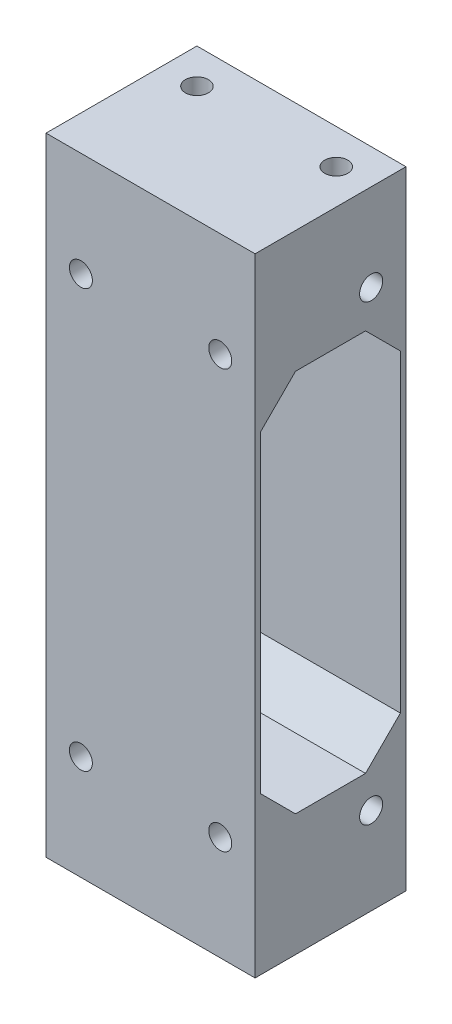
ISO-10303-21;
HEADER;
FILE_DESCRIPTION(('STEP AP214'),'2;1');
FILE_NAME('part.step','',(''),(''),'','','');
FILE_SCHEMA(('AUTOMOTIVE_DESIGN { 1 0 10303 214 1 1 1 1 }'));
ENDSEC;
DATA;
#1=APPLICATION_CONTEXT('core data for automotive mechanical design processes');
#2=APPLICATION_PROTOCOL_DEFINITION('international standard','automotive_design',2000,#1);
#3=PRODUCT_CONTEXT('',#1,'mechanical');
#4=PRODUCT('Part','Part','',(#3));
#5=PRODUCT_RELATED_PRODUCT_CATEGORY('part','',(#4));
#6=PRODUCT_DEFINITION_FORMATION('','',#4);
#7=PRODUCT_DEFINITION_CONTEXT('part definition',#1,'design');
#8=PRODUCT_DEFINITION('design','',#6,#7);
#9=PRODUCT_DEFINITION_SHAPE('','',#8);
#10=(LENGTH_UNIT() NAMED_UNIT(*) SI_UNIT(.MILLI.,.METRE.));
#11=(NAMED_UNIT(*) PLANE_ANGLE_UNIT() SI_UNIT($,.RADIAN.));
#12=(NAMED_UNIT(*) SI_UNIT($,.STERADIAN.) SOLID_ANGLE_UNIT());
#13=UNCERTAINTY_MEASURE_WITH_UNIT(LENGTH_MEASURE(1.E-05),#10,'distance_accuracy_value','');
#14=(GEOMETRIC_REPRESENTATION_CONTEXT(3) GLOBAL_UNCERTAINTY_ASSIGNED_CONTEXT((#13)) GLOBAL_UNIT_ASSIGNED_CONTEXT((#10,
#11,#12)) REPRESENTATION_CONTEXT('',''));
#15=CARTESIAN_POINT('',(0.,0.,0.));
#16=DIRECTION('',(0.,0.,1.));
#17=DIRECTION('',(1.,0.,0.));
#18=AXIS2_PLACEMENT_3D('',#15,#16,#17);
#19=CARTESIAN_POINT('',(15.,90.,10.825));
#20=DIRECTION('',(-1.,0.,0.));
#21=DIRECTION('',(0.,0.,1.));
#22=AXIS2_PLACEMENT_3D('',#19,#20,#21);
#23=PLANE('',#22);
#24=CARTESIAN_POINT('',(15.,12.5,-5.825));
#25=DIRECTION('',(1.,0.,0.));
#26=DIRECTION('',(0.,0.,-1.));
#27=AXIS2_PLACEMENT_3D('',#24,#25,#26);
#28=CIRCLE('',#27,1.64999999999999);
#29=CARTESIAN_POINT('',(15.,12.5,-7.47499999999999));
#30=VERTEX_POINT('',#29);
#31=EDGE_CURVE('E180',#30,#30,#28,.T.);
#32=ORIENTED_EDGE('',*,*,#31,.F.);
#33=EDGE_LOOP('',(#32));
#34=FACE_BOUND('',#33,.T.);
#35=CARTESIAN_POINT('',(15.,77.5,-5.825));
#36=DIRECTION('',(1.,0.,0.));
#37=DIRECTION('',(0.,0.,-1.));
#38=AXIS2_PLACEMENT_3D('',#35,#36,#37);
#39=CIRCLE('',#38,1.64999999999998);
#40=CARTESIAN_POINT('',(15.,77.5,-7.47499999999999));
#41=VERTEX_POINT('',#40);
#42=EDGE_CURVE('E179',#41,#41,#39,.T.);
#43=ORIENTED_EDGE('',*,*,#42,.F.);
#44=EDGE_LOOP('',(#43));
#45=FACE_BOUND('',#44,.T.);
#46=DIRECTION('',(0.,0.,1.));
#47=VECTOR('',#46,1.);
#48=CARTESIAN_POINT('',(15.,72.5,10.025));
#49=LINE('',#48,#47);
#50=CARTESIAN_POINT('',(15.,72.5,-5.02499999999996));
#51=VERTEX_POINT('',#50);
#52=CARTESIAN_POINT('',(15.,72.5,5.02500000000001));
#53=VERTEX_POINT('',#52);
#54=EDGE_CURVE('E245',#51,#53,#49,.T.);
#55=ORIENTED_EDGE('',*,*,#54,.F.);
#56=DIRECTION('',(0.,0.707106781186544,0.707106781186552));
#57=VECTOR('',#56,1.);
#58=CARTESIAN_POINT('',(15.,89.1749999999999,11.6500000000001));
#59=LINE('',#58,#57);
#60=CARTESIAN_POINT('',(15.,67.5,-10.025));
#61=VERTEX_POINT('',#60);
#62=EDGE_CURVE('E361',#51,#61,#59,.F.);
#63=ORIENTED_EDGE('',*,*,#62,.T.);
#64=DIRECTION('',(0.,1.,0.));
#65=VECTOR('',#64,1.);
#66=CARTESIAN_POINT('',(15.,17.5,-10.025));
#67=LINE('',#66,#65);
#68=CARTESIAN_POINT('',(15.,22.5,-10.025));
#69=VERTEX_POINT('',#68);
#70=EDGE_CURVE('E225',#69,#61,#67,.T.);
#71=ORIENTED_EDGE('',*,*,#70,.F.);
#72=DIRECTION('',(0.,0.707106781186552,-0.707106781186544));
#73=VECTOR('',#72,1.);
#74=CARTESIAN_POINT('',(15.,45.8250000000004,-33.3500000000001));
#75=LINE('',#74,#73);
#76=CARTESIAN_POINT('',(15.,17.5,-5.02500000000001));
#77=VERTEX_POINT('',#76);
#78=EDGE_CURVE('E367',#69,#77,#75,.F.);
#79=ORIENTED_EDGE('',*,*,#78,.T.);
#80=DIRECTION('',(0.,0.,-1.));
#81=VECTOR('',#80,1.);
#82=CARTESIAN_POINT('',(15.,17.5,10.025));
#83=LINE('',#82,#81);
#84=CARTESIAN_POINT('',(15.,17.5,5.02499999999996));
#85=VERTEX_POINT('',#84);
#86=EDGE_CURVE('E231',#85,#77,#83,.T.);
#87=ORIENTED_EDGE('',*,*,#86,.F.);
#88=DIRECTION('',(0.,-0.707106781186544,-0.707106781186552));
#89=VECTOR('',#88,1.);
#90=CARTESIAN_POINT('',(15.,56.6499999999996,44.175));
#91=LINE('',#90,#89);
#92=CARTESIAN_POINT('',(15.,22.5,10.025));
#93=VERTEX_POINT('',#92);
#94=EDGE_CURVE('E62',#85,#93,#91,.F.);
#95=ORIENTED_EDGE('',*,*,#94,.T.);
#96=DIRECTION('',(0.,-1.,0.));
#97=VECTOR('',#96,1.);
#98=CARTESIAN_POINT('',(15.,17.5,10.025));
#99=LINE('',#98,#97);
#100=CARTESIAN_POINT('',(15.,67.4999999999999,10.025));
#101=VERTEX_POINT('',#100);
#102=EDGE_CURVE('E249',#101,#93,#99,.T.);
#103=ORIENTED_EDGE('',*,*,#102,.F.);
#104=DIRECTION('',(0.,-0.707106781186552,0.707106781186544));
#105=VECTOR('',#104,1.);
#106=CARTESIAN_POINT('',(15.,78.3500000000001,-0.825000000000031));
#107=LINE('',#106,#105);
#108=EDGE_CURVE('E355',#101,#53,#107,.F.);
#109=ORIENTED_EDGE('',*,*,#108,.T.);
#110=EDGE_LOOP('',(#55,#63,#71,#79,#87,#95,#103,#109));
#111=FACE_BOUND('',#110,.T.);
#112=DIRECTION('',(0.,0.,-1.));
#113=VECTOR('',#112,1.);
#114=CARTESIAN_POINT('',(15.,0.,10.825));
#115=LINE('',#114,#113);
#116=CARTESIAN_POINT('',(15.,0.,10.825));
#117=VERTEX_POINT('',#116);
#118=CARTESIAN_POINT('',(15.,0.,-10.825));
#119=VERTEX_POINT('',#118);
#120=EDGE_CURVE('E286',#117,#119,#115,.T.);
#121=ORIENTED_EDGE('',*,*,#120,.T.);
#122=DIRECTION('',(0.,-1.,0.));
#123=VECTOR('',#122,1.);
#124=CARTESIAN_POINT('',(15.,90.,-10.825));
#125=LINE('',#124,#123);
#126=CARTESIAN_POINT('',(15.,90.,-10.825));
#127=VERTEX_POINT('',#126);
#128=EDGE_CURVE('E324',#127,#119,#125,.T.);
#129=ORIENTED_EDGE('',*,*,#128,.F.);
#130=DIRECTION('',(0.,0.,-1.));
#131=VECTOR('',#130,1.);
#132=CARTESIAN_POINT('',(15.,90.,10.825));
#133=LINE('',#132,#131);
#134=CARTESIAN_POINT('',(15.,90.,10.825));
#135=VERTEX_POINT('',#134);
#136=EDGE_CURVE('E287',#135,#127,#133,.T.);
#137=ORIENTED_EDGE('',*,*,#136,.F.);
#138=DIRECTION('',(0.,-1.,0.));
#139=VECTOR('',#138,1.);
#140=CARTESIAN_POINT('',(15.,90.,10.825));
#141=LINE('',#140,#139);
#142=EDGE_CURVE('E301',#135,#117,#141,.T.);
#143=ORIENTED_EDGE('',*,*,#142,.T.);
#144=EDGE_LOOP('',(#121,#129,#137,#143));
#145=FACE_BOUND('',#144,.T.);
#146=ADVANCED_FACE('F46',(#34,#45,#111,#145),#23,.F.);
#147=CARTESIAN_POINT('',(-15.,90.,-10.825));
#148=DIRECTION('',(0.,0.,1.));
#149=DIRECTION('',(1.,0.,0.));
#150=AXIS2_PLACEMENT_3D('',#147,#148,#149);
#151=PLANE('',#150);
#152=DIRECTION('',(-1.,0.,0.));
#153=VECTOR('',#152,1.);
#154=CARTESIAN_POINT('',(-15.,0.,-10.825));
#155=LINE('',#154,#153);
#156=CARTESIAN_POINT('',(-15.,0.,-10.825));
#157=VERTEX_POINT('',#156);
#158=EDGE_CURVE('E305',#119,#157,#155,.T.);
#159=ORIENTED_EDGE('',*,*,#158,.T.);
#160=DIRECTION('',(0.,-1.,0.));
#161=VECTOR('',#160,1.);
#162=CARTESIAN_POINT('',(-15.,90.,-10.825));
#163=LINE('',#162,#161);
#164=CARTESIAN_POINT('',(-15.,90.,-10.825));
#165=VERTEX_POINT('',#164);
#166=EDGE_CURVE('E320',#165,#157,#163,.T.);
#167=ORIENTED_EDGE('',*,*,#166,.F.);
#168=DIRECTION('',(-1.,0.,0.));
#169=VECTOR('',#168,1.);
#170=CARTESIAN_POINT('',(-15.,90.,-10.825));
#171=LINE('',#170,#169);
#172=EDGE_CURVE('E291',#127,#165,#171,.T.);
#173=ORIENTED_EDGE('',*,*,#172,.F.);
#174=ORIENTED_EDGE('',*,*,#128,.T.);
#175=EDGE_LOOP('',(#159,#167,#173,#174));
#176=FACE_BOUND('',#175,.T.);
#177=ADVANCED_FACE('F420',(#176),#151,.F.);
#178=CARTESIAN_POINT('',(-15.,90.,10.825));
#179=DIRECTION('',(1.,0.,0.));
#180=DIRECTION('',(0.,0.,-1.));
#181=AXIS2_PLACEMENT_3D('',#178,#179,#180);
#182=PLANE('',#181);
#183=DIRECTION('',(0.,-1.,0.));
#184=VECTOR('',#183,1.);
#185=CARTESIAN_POINT('',(-15.,17.5,10.025));
#186=LINE('',#185,#184);
#187=CARTESIAN_POINT('',(-15.,67.4999999999999,10.025));
#188=VERTEX_POINT('',#187);
#189=CARTESIAN_POINT('',(-15.,22.5,10.025));
#190=VERTEX_POINT('',#189);
#191=EDGE_CURVE('E235',#188,#190,#186,.T.);
#192=ORIENTED_EDGE('',*,*,#191,.T.);
#193=DIRECTION('',(0.,0.707106781186544,0.707106781186552));
#194=VECTOR('',#193,1.);
#195=CARTESIAN_POINT('',(-15.,56.6499999999996,44.175));
#196=LINE('',#195,#194);
#197=CARTESIAN_POINT('',(-15.,17.5,5.02499999999996));
#198=VERTEX_POINT('',#197);
#199=EDGE_CURVE('E11',#190,#198,#196,.F.);
#200=ORIENTED_EDGE('',*,*,#199,.T.);
#201=DIRECTION('',(0.,0.,-1.));
#202=VECTOR('',#201,1.);
#203=CARTESIAN_POINT('',(-15.,17.5,10.025));
#204=LINE('',#203,#202);
#205=CARTESIAN_POINT('',(-15.,17.5,-5.02500000000001));
#206=VERTEX_POINT('',#205);
#207=EDGE_CURVE('E238',#198,#206,#204,.T.);
#208=ORIENTED_EDGE('',*,*,#207,.T.);
#209=DIRECTION('',(0.,-0.707106781186552,0.707106781186544));
#210=VECTOR('',#209,1.);
#211=CARTESIAN_POINT('',(-15.,45.8250000000004,-33.3500000000001));
#212=LINE('',#211,#210);
#213=CARTESIAN_POINT('',(-15.,22.5,-10.025));
#214=VERTEX_POINT('',#213);
#215=EDGE_CURVE('E370',#206,#214,#212,.F.);
#216=ORIENTED_EDGE('',*,*,#215,.T.);
#217=DIRECTION('',(0.,1.,0.));
#218=VECTOR('',#217,1.);
#219=CARTESIAN_POINT('',(-15.,17.5,-10.025));
#220=LINE('',#219,#218);
#221=CARTESIAN_POINT('',(-15.,67.5,-10.025));
#222=VERTEX_POINT('',#221);
#223=EDGE_CURVE('E226',#214,#222,#220,.T.);
#224=ORIENTED_EDGE('',*,*,#223,.T.);
#225=DIRECTION('',(0.,-0.707106781186544,-0.707106781186552));
#226=VECTOR('',#225,1.);
#227=CARTESIAN_POINT('',(-15.,89.1749999999999,11.6500000000001));
#228=LINE('',#227,#226);
#229=CARTESIAN_POINT('',(-15.,72.5,-5.02499999999996));
#230=VERTEX_POINT('',#229);
#231=EDGE_CURVE('E364',#222,#230,#228,.F.);
#232=ORIENTED_EDGE('',*,*,#231,.T.);
#233=DIRECTION('',(0.,0.,1.));
#234=VECTOR('',#233,1.);
#235=CARTESIAN_POINT('',(-15.,72.5,10.025));
#236=LINE('',#235,#234);
#237=CARTESIAN_POINT('',(-15.,72.5,5.02500000000001));
#238=VERTEX_POINT('',#237);
#239=EDGE_CURVE('E230',#230,#238,#236,.T.);
#240=ORIENTED_EDGE('',*,*,#239,.T.);
#241=DIRECTION('',(0.,0.707106781186552,-0.707106781186544));
#242=VECTOR('',#241,1.);
#243=CARTESIAN_POINT('',(-15.,78.3500000000001,-0.825000000000031));
#244=LINE('',#243,#242);
#245=EDGE_CURVE('E358',#238,#188,#244,.F.);
#246=ORIENTED_EDGE('',*,*,#245,.T.);
#247=EDGE_LOOP('',(#192,#200,#208,#216,#224,#232,#240,#246));
#248=FACE_BOUND('',#247,.T.);
#249=DIRECTION('',(0.,0.,1.));
#250=VECTOR('',#249,1.);
#251=CARTESIAN_POINT('',(-15.,0.,10.825));
#252=LINE('',#251,#250);
#253=CARTESIAN_POINT('',(-15.,0.,10.825));
#254=VERTEX_POINT('',#253);
#255=EDGE_CURVE('E308',#157,#254,#252,.T.);
#256=ORIENTED_EDGE('',*,*,#255,.T.);
#257=DIRECTION('',(0.,-1.,0.));
#258=VECTOR('',#257,1.);
#259=CARTESIAN_POINT('',(-15.,90.,10.825));
#260=LINE('',#259,#258);
#261=CARTESIAN_POINT('',(-15.,90.,10.825));
#262=VERTEX_POINT('',#261);
#263=EDGE_CURVE('E316',#262,#254,#260,.T.);
#264=ORIENTED_EDGE('',*,*,#263,.F.);
#265=DIRECTION('',(0.,0.,1.));
#266=VECTOR('',#265,1.);
#267=CARTESIAN_POINT('',(-15.,90.,10.825));
#268=LINE('',#267,#266);
#269=EDGE_CURVE('E295',#165,#262,#268,.T.);
#270=ORIENTED_EDGE('',*,*,#269,.F.);
#271=ORIENTED_EDGE('',*,*,#166,.T.);
#272=EDGE_LOOP('',(#256,#264,#270,#271));
#273=FACE_BOUND('',#272,.T.);
#274=ADVANCED_FACE('F388',(#248,#273),#182,.F.);
#275=CARTESIAN_POINT('',(-15.,90.,10.825));
#276=DIRECTION('',(0.,0.,-1.));
#277=DIRECTION('',(-1.,0.,0.));
#278=AXIS2_PLACEMENT_3D('',#275,#276,#277);
#279=PLANE('',#278);
#280=CARTESIAN_POINT('',(-10.,15.,10.825));
#281=DIRECTION('',(0.,0.,1.));
#282=DIRECTION('',(1.,0.,0.));
#283=AXIS2_PLACEMENT_3D('',#280,#281,#282);
#284=CIRCLE('',#283,1.64999999999999);
#285=CARTESIAN_POINT('',(-8.35000000000001,15.,10.825));
#286=VERTEX_POINT('',#285);
#287=EDGE_CURVE('E193',#286,#286,#284,.T.);
#288=ORIENTED_EDGE('',*,*,#287,.F.);
#289=EDGE_LOOP('',(#288));
#290=FACE_BOUND('',#289,.T.);
#291=CARTESIAN_POINT('',(10.,15.,10.825));
#292=DIRECTION('',(0.,0.,1.));
#293=DIRECTION('',(1.,0.,0.));
#294=AXIS2_PLACEMENT_3D('',#291,#292,#293);
#295=CIRCLE('',#294,1.64999999999999);
#296=CARTESIAN_POINT('',(11.65,15.,10.825));
#297=VERTEX_POINT('',#296);
#298=EDGE_CURVE('E201',#297,#297,#295,.T.);
#299=ORIENTED_EDGE('',*,*,#298,.F.);
#300=EDGE_LOOP('',(#299));
#301=FACE_BOUND('',#300,.T.);
#302=CARTESIAN_POINT('',(9.99999999999979,75.,10.825));
#303=DIRECTION('',(0.,0.,1.));
#304=DIRECTION('',(1.,0.,0.));
#305=AXIS2_PLACEMENT_3D('',#302,#303,#304);
#306=CIRCLE('',#305,1.64999999999999);
#307=CARTESIAN_POINT('',(11.6499999999998,75.,10.825));
#308=VERTEX_POINT('',#307);
#309=EDGE_CURVE('E209',#308,#308,#306,.T.);
#310=ORIENTED_EDGE('',*,*,#309,.F.);
#311=EDGE_LOOP('',(#310));
#312=FACE_BOUND('',#311,.T.);
#313=CARTESIAN_POINT('',(-10.0000000000002,75.,10.825));
#314=DIRECTION('',(0.,0.,1.));
#315=DIRECTION('',(1.,0.,0.));
#316=AXIS2_PLACEMENT_3D('',#313,#314,#315);
#317=CIRCLE('',#316,1.64999999999999);
#318=CARTESIAN_POINT('',(-8.35000000000022,75.,10.825));
#319=VERTEX_POINT('',#318);
#320=EDGE_CURVE('E217',#319,#319,#317,.T.);
#321=ORIENTED_EDGE('',*,*,#320,.F.);
#322=EDGE_LOOP('',(#321));
#323=FACE_BOUND('',#322,.T.);
#324=DIRECTION('',(1.,0.,0.));
#325=VECTOR('',#324,1.);
#326=CARTESIAN_POINT('',(-15.,0.,10.825));
#327=LINE('',#326,#325);
#328=EDGE_CURVE('E292',#254,#117,#327,.T.);
#329=ORIENTED_EDGE('',*,*,#328,.T.);
#330=ORIENTED_EDGE('',*,*,#142,.F.);
#331=DIRECTION('',(1.,0.,0.));
#332=VECTOR('',#331,1.);
#333=CARTESIAN_POINT('',(-15.,90.,10.825));
#334=LINE('',#333,#332);
#335=EDGE_CURVE('E298',#262,#135,#334,.T.);
#336=ORIENTED_EDGE('',*,*,#335,.F.);
#337=ORIENTED_EDGE('',*,*,#263,.T.);
#338=EDGE_LOOP('',(#329,#330,#336,#337));
#339=FACE_BOUND('',#338,.T.);
#340=ADVANCED_FACE('F432',(#290,#301,#312,#323,#339),#279,.F.);
#341=CARTESIAN_POINT('',(0.,90.,0.));
#342=DIRECTION('',(0.,-1.,0.));
#343=DIRECTION('',(0.,0.,-1.));
#344=AXIS2_PLACEMENT_3D('',#341,#342,#343);
#345=PLANE('',#344);
#346=CARTESIAN_POINT('',(-10.,90.,-5.825));
#347=DIRECTION('',(0.,1.,0.));
#348=DIRECTION('',(0.,0.,1.));
#349=AXIS2_PLACEMENT_3D('',#346,#347,#348);
#350=CIRCLE('',#349,1.64999999999999);
#351=CARTESIAN_POINT('',(-10.,90.,-4.17500000000001));
#352=VERTEX_POINT('',#351);
#353=EDGE_CURVE('E270',#352,#352,#350,.T.);
#354=ORIENTED_EDGE('',*,*,#353,.F.);
#355=EDGE_LOOP('',(#354));
#356=FACE_BOUND('',#355,.T.);
#357=CARTESIAN_POINT('',(10.,90.,-5.825));
#358=DIRECTION('',(0.,1.,0.));
#359=DIRECTION('',(0.,0.,1.));
#360=AXIS2_PLACEMENT_3D('',#357,#358,#359);
#361=CIRCLE('',#360,1.64999999999999);
#362=CARTESIAN_POINT('',(10.,90.,-4.17500000000001));
#363=VERTEX_POINT('',#362);
#364=EDGE_CURVE('E278',#363,#363,#361,.T.);
#365=ORIENTED_EDGE('',*,*,#364,.F.);
#366=EDGE_LOOP('',(#365));
#367=FACE_BOUND('',#366,.T.);
#368=ORIENTED_EDGE('',*,*,#136,.T.);
#369=ORIENTED_EDGE('',*,*,#172,.T.);
#370=ORIENTED_EDGE('',*,*,#269,.T.);
#371=ORIENTED_EDGE('',*,*,#335,.T.);
#372=EDGE_LOOP('',(#368,#369,#370,#371));
#373=FACE_BOUND('',#372,.T.);
#374=ADVANCED_FACE('F435',(#356,#367,#373),#345,.F.);
#375=CARTESIAN_POINT('',(0.,0.,0.));
#376=DIRECTION('',(0.,-1.,0.));
#377=DIRECTION('',(0.,0.,-1.));
#378=AXIS2_PLACEMENT_3D('',#375,#376,#377);
#379=PLANE('',#378);
#380=CARTESIAN_POINT('',(10.,0.,0.824999999999998));
#381=DIRECTION('',(0.,-1.,0.));
#382=DIRECTION('',(0.,0.,-1.));
#383=AXIS2_PLACEMENT_3D('',#380,#381,#382);
#384=CIRCLE('',#383,1.64999999999999);
#385=CARTESIAN_POINT('',(10.,0.,-0.824999999999992));
#386=VERTEX_POINT('',#385);
#387=EDGE_CURVE('E241',#386,#386,#384,.T.);
#388=ORIENTED_EDGE('',*,*,#387,.F.);
#389=EDGE_LOOP('',(#388));
#390=FACE_BOUND('',#389,.T.);
#391=CARTESIAN_POINT('',(-10.,0.,0.824999999999998));
#392=DIRECTION('',(0.,-1.,0.));
#393=DIRECTION('',(0.,0.,-1.));
#394=AXIS2_PLACEMENT_3D('',#391,#392,#393);
#395=CIRCLE('',#394,1.64999999999999);
#396=CARTESIAN_POINT('',(-10.,0.,-0.824999999999992));
#397=VERTEX_POINT('',#396);
#398=EDGE_CURVE('E262',#397,#397,#395,.T.);
#399=ORIENTED_EDGE('',*,*,#398,.F.);
#400=EDGE_LOOP('',(#399));
#401=FACE_BOUND('',#400,.T.);
#402=ORIENTED_EDGE('',*,*,#120,.F.);
#403=ORIENTED_EDGE('',*,*,#328,.F.);
#404=ORIENTED_EDGE('',*,*,#255,.F.);
#405=ORIENTED_EDGE('',*,*,#158,.F.);
#406=EDGE_LOOP('',(#402,#403,#404,#405));
#407=FACE_BOUND('',#406,.T.);
#408=ADVANCED_FACE('F437',(#390,#401,#407),#379,.T.);
#409=CARTESIAN_POINT('',(10.,80.,-5.825));
#410=DIRECTION('',(0.,1.,0.));
#411=DIRECTION('',(0.,0.,1.));
#412=AXIS2_PLACEMENT_3D('',#409,#410,#411);
#413=CONICAL_SURFACE('',#412,1.65,1.02974425867665);
#414=CARTESIAN_POINT('',(9.92746379970586,79.1375801411423,-6.0270675408364));
#415=CARTESIAN_POINT('',(9.94116112806103,79.1370823298473,-6.0311032409137));
#416=CARTESIAN_POINT('',(9.95521703706664,79.1367129726104,-6.03398240398629));
#417=CARTESIAN_POINT('',(9.98363126533966,79.1362762243211,-6.03737459167109));
#418=CARTESIAN_POINT('',(9.99799004508844,79.1362093322481,-6.0378837064351));
#419=CARTESIAN_POINT('',(10.0266173188342,79.1363862292057,-6.03651974691987));
#420=CARTESIAN_POINT('',(10.0408856331645,79.1366305119581,-6.034642886972));
#421=CARTESIAN_POINT('',(10.0688966285327,79.1374020505511,-6.02852872349294));
#422=CARTESIAN_POINT('',(10.0826394650955,79.1379292219602,-6.02429212424064));
#423=CARTESIAN_POINT('',(10.1091266803514,79.1392002913754,-6.01355082647172));
#424=CARTESIAN_POINT('',(10.1218754173165,79.1399431669965,-6.00705679961816));
#425=CARTESIAN_POINT('',(10.1460146925896,79.141554270822,-5.99190532680886));
#426=CARTESIAN_POINT('',(10.1574053610597,79.1424224869956,-5.98324808842958));
#427=CARTESIAN_POINT('',(10.1777888644408,79.1441194454669,-5.96448070446056));
#428=CARTESIAN_POINT('',(10.1868791715945,79.1449477301138,-5.95447675816829));
#429=CARTESIAN_POINT('',(10.2030224057152,79.1465013057052,-5.93293268920161));
#430=CARTESIAN_POINT('',(10.2100770448818,79.1472266829426,-5.92139386951519));
#431=CARTESIAN_POINT('',(10.2211672564435,79.1484041176461,-5.89836818162492));
#432=CARTESIAN_POINT('',(10.2254366887913,79.1488764522592,-5.8869950653784));
#433=CARTESIAN_POINT('',(10.2317878181886,79.1495884922629,-5.86364792063291));
#434=CARTESIAN_POINT('',(10.2338711813692,79.1498283748082,-5.85167435707379));
#435=CARTESIAN_POINT('',(10.2356411499156,79.1500320129145,-5.82870139596305));
#436=CARTESIAN_POINT('',(10.2355372427413,79.1500199044811,-5.81771790388931));
#437=CARTESIAN_POINT('',(10.2334481570771,79.1497799251529,-5.79593537167668));
#438=CARTESIAN_POINT('',(10.2314632853776,79.1495520894439,-5.78513630175044));
#439=CARTESIAN_POINT('',(10.225779932809,79.1489149517431,-5.76428918485796));
#440=CARTESIAN_POINT('',(10.2221239390467,79.1485101592784,-5.75422930582687));
#441=CARTESIAN_POINT('',(10.2132690191866,79.1475626124912,-5.7348226178345));
#442=CARTESIAN_POINT('',(10.2080698099081,79.1470198328507,-5.72547594014198));
#443=CARTESIAN_POINT('',(10.1959881273886,79.1458154946476,-5.70718614876835));
#444=CARTESIAN_POINT('',(10.1890276062836,79.145148981894,-5.69829506426641));
#445=CARTESIAN_POINT('',(10.1738349344551,79.1437850024614,-5.68168040595542));
#446=CARTESIAN_POINT('',(10.1656023062892,79.1430875242308,-5.67395727265967));
#447=CARTESIAN_POINT('',(10.1472422650769,79.1416570927709,-5.65909902977115));
#448=CARTESIAN_POINT('',(10.1370082860967,79.1409273412634,-5.65209529753914));
#449=CARTESIAN_POINT('',(10.1155844148796,79.1395777680839,-5.63973403418361));
#450=CARTESIAN_POINT('',(10.1043941425534,79.1389579904261,-5.63437716154823));
#451=CARTESIAN_POINT('',(10.0802816419267,79.1378374676365,-5.62496732709076));
#452=CARTESIAN_POINT('',(10.0672945767876,79.1373527654607,-5.62107815412327));
#453=CARTESIAN_POINT('',(10.040862318223,79.1366353564057,-5.61539823358542));
#454=CARTESIAN_POINT('',(10.0274169923451,79.1364027230307,-5.61360809808954));
#455=CARTESIAN_POINT('',(9.9996927843722,79.1362090354368,-5.61211334517824));
#456=CARTESIAN_POINT('',(9.98540743892417,79.1362630018945,-5.61252408528603));
#457=CARTESIAN_POINT('',(9.95710192969509,79.1366716479906,-5.61569542955075));
#458=CARTESIAN_POINT('',(9.94308180999865,79.137026377179,-5.61845642090784));
#459=CARTESIAN_POINT('',(9.91559224887187,79.1379994225431,-5.62632016971914));
#460=CARTESIAN_POINT('',(9.90212845654159,79.1386199389983,-5.63144250279217));
#461=CARTESIAN_POINT('',(9.87630326496206,79.1400493162303,-5.64395382017901));
#462=CARTESIAN_POINT('',(9.86394183293558,79.1408581714045,-5.65134273706991));
#463=CARTESIAN_POINT('',(9.84122003178176,79.1425266693455,-5.66792457687203));
#464=CARTESIAN_POINT('',(9.83080090339613,79.1433831534354,-5.67703700039259));
#465=CARTESIAN_POINT('',(9.81182984302518,79.1450612668081,-5.69704037344355));
#466=CARTESIAN_POINT('',(9.80327670628719,79.1458829183024,-5.70793016745042));
#467=CARTESIAN_POINT('',(9.78914039238787,79.1473049680503,-5.73013900563164));
#468=CARTESIAN_POINT('',(9.78335888729383,79.1479186396997,-5.74133068761218));
#469=CARTESIAN_POINT('',(9.7740046008861,79.1489354490927,-5.76460988538816));
#470=CARTESIAN_POINT('',(9.77042983634903,79.149338775825,-5.77669658584501));
#471=CARTESIAN_POINT('',(9.76594997931308,79.1498480813527,-5.80003871128061));
#472=CARTESIAN_POINT('',(9.76480331733722,79.1499809087715,-5.8112475703372));
#473=CARTESIAN_POINT('',(9.76450547905704,79.1500152092453,-5.83369069142526));
#474=CARTESIAN_POINT('',(9.7653536559511,79.1499167572898,-5.84492494404319));
#475=CARTESIAN_POINT('',(9.76890666580244,79.1495114519229,-5.86650612764739));
#476=CARTESIAN_POINT('',(9.77151587833403,79.1492153397141,-5.87686925663345));
#477=CARTESIAN_POINT('',(9.77837253818332,79.1484579471677,-5.89702946422465));
#478=CARTESIAN_POINT('',(9.78262007091187,79.1479966582189,-5.90682651328762));
#479=CARTESIAN_POINT('',(9.7927526181147,79.146937693535,-5.92595129704879));
#480=CARTESIAN_POINT('',(9.79868824717446,79.1463359255536,-5.93525187550184));
#481=CARTESIAN_POINT('',(9.81191485135292,79.1450645685754,-5.95282959677666));
#482=CARTESIAN_POINT('',(9.81920660086669,79.1443949409281,-5.96110615032272));
#483=CARTESIAN_POINT('',(9.83563459905839,79.1429871992297,-5.97719780658628));
#484=CARTESIAN_POINT('',(9.84487811735114,79.1422483779968,-5.98490312257338));
#485=CARTESIAN_POINT('',(9.86442660524608,79.1408347862928,-5.99881073154598));
#486=CARTESIAN_POINT('',(9.87473082936185,79.140159971469,-6.00501407001238));
#487=CARTESIAN_POINT('',(9.89216179005891,79.1391624899248,-6.01383327434516));
#488=CARTESIAN_POINT('',(9.89904987461033,79.1388020323947,-6.01692643683656));
#489=CARTESIAN_POINT('',(9.91307982382053,79.1381424600928,-6.02247668754057));
#490=CARTESIAN_POINT('',(9.92022169128969,79.1378433460006,-6.02493376870675));
#491=CARTESIAN_POINT('',(9.92746379970586,79.1375801411423,-6.0270675408364));
#492=B_SPLINE_CURVE_WITH_KNOTS('',3,(#414,#415,#416,#417,#418,#419,#420,#421,#422,#423,#424,
#425,#426,#427,#428,#429,#430,#431,#432,#433,#434,#435,#436,#437,#438,#439,#440,#441,#442,#443,
#444,#445,#446,#447,#448,#449,#450,#451,#452,#453,#454,#455,#456,#457,#458,#459,#460,#461,#462,
#463,#464,#465,#466,#467,#468,#469,#470,#471,#472,#473,#474,#475,#476,#477,#478,#479,#480,#481,
#482,#483,#484,#485,#486,#487,#488,#489,#490,#491),.UNSPECIFIED.,.T.,.F.,(4,2,2,2,2,2,2,2,2,2,2,
2,2,2,2,2,2,2,2,2,2,2,2,2,2,2,2,2,2,2,2,2,2,2,2,2,2,2,4),(0.,0.0428368005582254,
0.0857442436320292,0.128719850158923,0.171682637215991,0.214445025544914,0.257203312074972,
0.297608093070456,0.337978789888616,0.374249231581227,0.41049200932622,0.443280891457642,
0.476064426552302,0.508057220857464,0.540055889485566,0.573849094627791,0.607655013851789,
0.644767121504424,0.68189404899547,0.722412105736595,0.76294197451391,0.805616302421,
0.848297662216681,0.891339397523079,0.934379852613036,0.975761564705726,1.01711647965533,
1.0547404206909,1.0923304992385,1.12596057108709,1.15957974030746,1.19150639969715,
1.22343472375009,1.25644506929375,1.28947432317174,1.32549674070264,1.36149401157109,
1.38414261203638,1.40679146338903),.UNSPECIFIED.);
#493=CARTESIAN_POINT('',(9.92746379970586,79.1375801411423,-6.0270675408364));
#494=VERTEX_POINT('',#493);
#495=EDGE_CURVE('E51',#494,#494,#492,.T.);
#496=ORIENTED_EDGE('',*,*,#495,.T.);
#497=EDGE_LOOP('',(#496));
#498=FACE_BOUND('',#497,.T.);
#499=CARTESIAN_POINT('',(10.,80.,-5.825));
#500=DIRECTION('',(0.,1.,0.));
#501=DIRECTION('',(0.,0.,1.));
#502=AXIS2_PLACEMENT_3D('',#499,#500,#501);
#503=CIRCLE('',#502,1.65);
#504=CARTESIAN_POINT('',(10.,80.,-4.175));
#505=VERTEX_POINT('',#504);
#506=EDGE_CURVE('E282',#505,#505,#503,.T.);
#507=ORIENTED_EDGE('',*,*,#506,.T.);
#508=EDGE_LOOP('',(#507));
#509=FACE_BOUND('',#508,.T.);
#510=ADVANCED_FACE('F440',(#498,#509),#413,.F.);
#511=CARTESIAN_POINT('',(10.,90.,-5.825));
#512=DIRECTION('',(0.,1.,0.));
#513=DIRECTION('',(0.,0.,1.));
#514=AXIS2_PLACEMENT_3D('',#511,#512,#513);
#515=CYLINDRICAL_SURFACE('',#514,1.64999999999999);
#516=ORIENTED_EDGE('',*,*,#506,.F.);
#517=EDGE_LOOP('',(#516));
#518=FACE_BOUND('',#517,.T.);
#519=ORIENTED_EDGE('',*,*,#364,.T.);
#520=EDGE_LOOP('',(#519));
#521=FACE_BOUND('',#520,.T.);
#522=ADVANCED_FACE('F447',(#518,#521),#515,.F.);
#523=CARTESIAN_POINT('',(-10.,80.,-5.825));
#524=DIRECTION('',(0.,1.,0.));
#525=DIRECTION('',(0.,0.,1.));
#526=AXIS2_PLACEMENT_3D('',#523,#524,#525);
#527=CONICAL_SURFACE('',#526,1.65,1.02974425867665);
#528=CARTESIAN_POINT('',(-10.,79.0085799786045,-5.825));
#529=VERTEX_POINT('',#528);
#530=VERTEX_LOOP('',#529);
#531=FACE_BOUND('',#530,.T.);
#532=CARTESIAN_POINT('',(-10.,80.,-5.825));
#533=DIRECTION('',(0.,1.,0.));
#534=DIRECTION('',(0.,0.,1.));
#535=AXIS2_PLACEMENT_3D('',#532,#533,#534);
#536=CIRCLE('',#535,1.65);
#537=CARTESIAN_POINT('',(-10.,80.,-4.175));
#538=VERTEX_POINT('',#537);
#539=EDGE_CURVE('E274',#538,#538,#536,.T.);
#540=ORIENTED_EDGE('',*,*,#539,.T.);
#541=EDGE_LOOP('',(#540));
#542=FACE_BOUND('',#541,.T.);
#543=ADVANCED_FACE('F451',(#531,#542),#527,.F.);
#544=CARTESIAN_POINT('',(-10.,90.,-5.825));
#545=DIRECTION('',(0.,1.,0.));
#546=DIRECTION('',(0.,0.,1.));
#547=AXIS2_PLACEMENT_3D('',#544,#545,#546);
#548=CYLINDRICAL_SURFACE('',#547,1.64999999999999);
#549=ORIENTED_EDGE('',*,*,#539,.F.);
#550=EDGE_LOOP('',(#549));
#551=FACE_BOUND('',#550,.T.);
#552=ORIENTED_EDGE('',*,*,#353,.T.);
#553=EDGE_LOOP('',(#552));
#554=FACE_BOUND('',#553,.T.);
#555=ADVANCED_FACE('F455',(#551,#554),#548,.F.);
#556=CARTESIAN_POINT('',(-10.,12.,0.824999999999998));
#557=DIRECTION('',(0.,-1.,0.));
#558=DIRECTION('',(0.,0.,-1.));
#559=AXIS2_PLACEMENT_3D('',#556,#557,#558);
#560=CONICAL_SURFACE('',#559,1.65,1.02974425867665);
#561=CARTESIAN_POINT('',(-10.,12.9914200213955,0.824999999999998));
#562=VERTEX_POINT('',#561);
#563=VERTEX_LOOP('',#562);
#564=FACE_BOUND('',#563,.T.);
#565=CARTESIAN_POINT('',(-10.,12.,0.824999999999998));
#566=DIRECTION('',(0.,-1.,0.));
#567=DIRECTION('',(0.,0.,-1.));
#568=AXIS2_PLACEMENT_3D('',#565,#566,#567);
#569=CIRCLE('',#568,1.65);
#570=CARTESIAN_POINT('',(-10.,12.,-0.824999999999999));
#571=VERTEX_POINT('',#570);
#572=EDGE_CURVE('E266',#571,#571,#569,.T.);
#573=ORIENTED_EDGE('',*,*,#572,.T.);
#574=EDGE_LOOP('',(#573));
#575=FACE_BOUND('',#574,.T.);
#576=ADVANCED_FACE('F459',(#564,#575),#560,.F.);
#577=CARTESIAN_POINT('',(-10.,0.,0.824999999999998));
#578=DIRECTION('',(0.,-1.,0.));
#579=DIRECTION('',(0.,0.,-1.));
#580=AXIS2_PLACEMENT_3D('',#577,#578,#579);
#581=CYLINDRICAL_SURFACE('',#580,1.64999999999999);
#582=ORIENTED_EDGE('',*,*,#572,.F.);
#583=EDGE_LOOP('',(#582));
#584=FACE_BOUND('',#583,.T.);
#585=ORIENTED_EDGE('',*,*,#398,.T.);
#586=EDGE_LOOP('',(#585));
#587=FACE_BOUND('',#586,.T.);
#588=ADVANCED_FACE('F463',(#584,#587),#581,.F.);
#589=CARTESIAN_POINT('',(10.,12.,0.824999999999998));
#590=DIRECTION('',(0.,-1.,0.));
#591=DIRECTION('',(0.,0.,-1.));
#592=AXIS2_PLACEMENT_3D('',#589,#590,#591);
#593=CONICAL_SURFACE('',#592,1.65,1.02974425867665);
#594=CARTESIAN_POINT('',(10.,12.9914200213955,0.824999999999998));
#595=VERTEX_POINT('',#594);
#596=VERTEX_LOOP('',#595);
#597=FACE_BOUND('',#596,.T.);
#598=CARTESIAN_POINT('',(10.,12.,0.824999999999998));
#599=DIRECTION('',(0.,-1.,0.));
#600=DIRECTION('',(0.,0.,-1.));
#601=AXIS2_PLACEMENT_3D('',#598,#599,#600);
#602=CIRCLE('',#601,1.65);
#603=CARTESIAN_POINT('',(10.,12.,-0.824999999999999));
#604=VERTEX_POINT('',#603);
#605=EDGE_CURVE('E258',#604,#604,#602,.T.);
#606=ORIENTED_EDGE('',*,*,#605,.T.);
#607=EDGE_LOOP('',(#606));
#608=FACE_BOUND('',#607,.T.);
#609=ADVANCED_FACE('F467',(#597,#608),#593,.F.);
#610=CARTESIAN_POINT('',(10.,0.,0.824999999999998));
#611=DIRECTION('',(0.,-1.,0.));
#612=DIRECTION('',(0.,0.,-1.));
#613=AXIS2_PLACEMENT_3D('',#610,#611,#612);
#614=CYLINDRICAL_SURFACE('',#613,1.64999999999999);
#615=ORIENTED_EDGE('',*,*,#605,.F.);
#616=EDGE_LOOP('',(#615));
#617=FACE_BOUND('',#616,.T.);
#618=ORIENTED_EDGE('',*,*,#387,.T.);
#619=EDGE_LOOP('',(#618));
#620=FACE_BOUND('',#619,.T.);
#621=ADVANCED_FACE('F471',(#617,#620),#614,.F.);
#622=CARTESIAN_POINT('',(-15.,17.5,-10.025));
#623=DIRECTION('',(0.,0.,-1.));
#624=DIRECTION('',(-1.,0.,0.));
#625=AXIS2_PLACEMENT_3D('',#622,#623,#624);
#626=PLANE('',#625);
#627=ORIENTED_EDGE('',*,*,#70,.T.);
#628=DIRECTION('',(-1.,0.,0.));
#629=VECTOR('',#628,1.);
#630=CARTESIAN_POINT('',(-15.,67.5,-10.025));
#631=LINE('',#630,#629);
#632=EDGE_CURVE('E346',#61,#222,#631,.T.);
#633=ORIENTED_EDGE('',*,*,#632,.T.);
#634=ORIENTED_EDGE('',*,*,#223,.F.);
#635=DIRECTION('',(1.,0.,0.));
#636=VECTOR('',#635,1.);
#637=CARTESIAN_POINT('',(15.,22.5,-10.025));
#638=LINE('',#637,#636);
#639=EDGE_CURVE('E342',#214,#69,#638,.T.);
#640=ORIENTED_EDGE('',*,*,#639,.T.);
#641=EDGE_LOOP('',(#627,#633,#634,#640));
#642=FACE_BOUND('',#641,.T.);
#643=ADVANCED_FACE('F396',(#642),#626,.F.);
#644=CARTESIAN_POINT('',(-15.,17.5,10.025));
#645=DIRECTION('',(0.,-1.,0.));
#646=DIRECTION('',(0.,0.,-1.));
#647=AXIS2_PLACEMENT_3D('',#644,#645,#646);
#648=PLANE('',#647);
#649=ORIENTED_EDGE('',*,*,#86,.T.);
#650=DIRECTION('',(-1.,0.,0.));
#651=VECTOR('',#650,1.);
#652=CARTESIAN_POINT('',(-15.,17.5,-5.02500000000001));
#653=LINE('',#652,#651);
#654=EDGE_CURVE('E69',#77,#206,#653,.T.);
#655=ORIENTED_EDGE('',*,*,#654,.T.);
#656=ORIENTED_EDGE('',*,*,#207,.F.);
#657=DIRECTION('',(1.,0.,0.));
#658=VECTOR('',#657,1.);
#659=CARTESIAN_POINT('',(15.,17.5,5.02499999999996));
#660=LINE('',#659,#658);
#661=EDGE_CURVE('E349',#198,#85,#660,.T.);
#662=ORIENTED_EDGE('',*,*,#661,.T.);
#663=EDGE_LOOP('',(#649,#655,#656,#662));
#664=FACE_BOUND('',#663,.T.);
#665=ADVANCED_FACE('F386',(#664),#648,.F.);
#666=CARTESIAN_POINT('',(-15.,17.5,10.025));
#667=DIRECTION('',(0.,0.,1.));
#668=DIRECTION('',(1.,0.,0.));
#669=AXIS2_PLACEMENT_3D('',#666,#667,#668);
#670=PLANE('',#669);
#671=ORIENTED_EDGE('',*,*,#191,.F.);
#672=DIRECTION('',(1.,0.,0.));
#673=VECTOR('',#672,1.);
#674=CARTESIAN_POINT('',(15.,67.4999999999999,10.025));
#675=LINE('',#674,#673);
#676=EDGE_CURVE('E331',#188,#101,#675,.T.);
#677=ORIENTED_EDGE('',*,*,#676,.T.);
#678=ORIENTED_EDGE('',*,*,#102,.T.);
#679=DIRECTION('',(-1.,0.,0.));
#680=VECTOR('',#679,1.);
#681=CARTESIAN_POINT('',(-15.,22.5,10.025));
#682=LINE('',#681,#680);
#683=EDGE_CURVE('E328',#93,#190,#682,.T.);
#684=ORIENTED_EDGE('',*,*,#683,.T.);
#685=EDGE_LOOP('',(#671,#677,#678,#684));
#686=FACE_BOUND('',#685,.T.);
#687=ADVANCED_FACE('F384',(#686),#670,.F.);
#688=CARTESIAN_POINT('',(-15.,72.5,10.025));
#689=DIRECTION('',(0.,1.,0.));
#690=DIRECTION('',(0.,0.,1.));
#691=AXIS2_PLACEMENT_3D('',#688,#689,#690);
#692=PLANE('',#691);
#693=ORIENTED_EDGE('',*,*,#54,.T.);
#694=DIRECTION('',(-1.,0.,0.));
#695=VECTOR('',#694,1.);
#696=CARTESIAN_POINT('',(-15.,72.5,5.02500000000001));
#697=LINE('',#696,#695);
#698=EDGE_CURVE('E339',#53,#238,#697,.T.);
#699=ORIENTED_EDGE('',*,*,#698,.T.);
#700=ORIENTED_EDGE('',*,*,#239,.F.);
#701=DIRECTION('',(1.,0.,0.));
#702=VECTOR('',#701,1.);
#703=CARTESIAN_POINT('',(15.,72.5,-5.02499999999996));
#704=LINE('',#703,#702);
#705=EDGE_CURVE('E335',#230,#51,#704,.T.);
#706=ORIENTED_EDGE('',*,*,#705,.T.);
#707=EDGE_LOOP('',(#693,#699,#700,#706));
#708=FACE_BOUND('',#707,.T.);
#709=ADVANCED_FACE('F404',(#708),#692,.F.);
#710=CARTESIAN_POINT('',(-15.,67.4999999999999,10.025));
#711=DIRECTION('',(0.,-0.707106781186543,-0.707106781186551));
#712=DIRECTION('',(-1.,0.,0.));
#713=AXIS2_PLACEMENT_3D('',#710,#711,#712);
#714=PLANE('',#713);
#715=ORIENTED_EDGE('',*,*,#245,.F.);
#716=ORIENTED_EDGE('',*,*,#698,.F.);
#717=ORIENTED_EDGE('',*,*,#108,.F.);
#718=ORIENTED_EDGE('',*,*,#676,.F.);
#719=EDGE_LOOP('',(#715,#716,#717,#718));
#720=FACE_BOUND('',#719,.T.);
#721=ADVANCED_FACE('F408',(#720),#714,.T.);
#722=CARTESIAN_POINT('',(-15.,72.5,-5.02499999999996));
#723=DIRECTION('',(0.,-0.707106781186551,0.707106781186543));
#724=DIRECTION('',(-1.,0.,0.));
#725=AXIS2_PLACEMENT_3D('',#722,#723,#724);
#726=PLANE('',#725);
#727=ORIENTED_EDGE('',*,*,#231,.F.);
#728=ORIENTED_EDGE('',*,*,#632,.F.);
#729=ORIENTED_EDGE('',*,*,#62,.F.);
#730=ORIENTED_EDGE('',*,*,#705,.F.);
#731=EDGE_LOOP('',(#727,#728,#729,#730));
#732=FACE_BOUND('',#731,.T.);
#733=ADVANCED_FACE('F401',(#732),#726,.T.);
#734=CARTESIAN_POINT('',(-15.,22.5,-10.025));
#735=DIRECTION('',(0.,0.707106781186543,0.707106781186551));
#736=DIRECTION('',(-1.,0.,0.));
#737=AXIS2_PLACEMENT_3D('',#734,#735,#736);
#738=PLANE('',#737);
#739=ORIENTED_EDGE('',*,*,#215,.F.);
#740=ORIENTED_EDGE('',*,*,#654,.F.);
#741=ORIENTED_EDGE('',*,*,#78,.F.);
#742=ORIENTED_EDGE('',*,*,#639,.F.);
#743=EDGE_LOOP('',(#739,#740,#741,#742));
#744=FACE_BOUND('',#743,.T.);
#745=ADVANCED_FACE('F393',(#744),#738,.T.);
#746=CARTESIAN_POINT('',(-15.,17.5,5.02499999999996));
#747=DIRECTION('',(0.,0.707106781186551,-0.707106781186543));
#748=DIRECTION('',(-1.,0.,0.));
#749=AXIS2_PLACEMENT_3D('',#746,#747,#748);
#750=PLANE('',#749);
#751=ORIENTED_EDGE('',*,*,#199,.F.);
#752=ORIENTED_EDGE('',*,*,#683,.F.);
#753=ORIENTED_EDGE('',*,*,#94,.F.);
#754=ORIENTED_EDGE('',*,*,#661,.F.);
#755=EDGE_LOOP('',(#751,#752,#753,#754));
#756=FACE_BOUND('',#755,.T.);
#757=ADVANCED_FACE('F49',(#756),#750,.T.);
#758=CARTESIAN_POINT('',(-10.0000000000002,75.,0.824999999999999));
#759=DIRECTION('',(0.,0.,1.));
#760=DIRECTION('',(1.,0.,0.));
#761=AXIS2_PLACEMENT_3D('',#758,#759,#760);
#762=CONICAL_SURFACE('',#761,1.65,1.02974425867665);
#763=CARTESIAN_POINT('',(-10.0000000000002,75.,-0.166420021395476));
#764=VERTEX_POINT('',#763);
#765=VERTEX_LOOP('',#764);
#766=FACE_BOUND('',#765,.T.);
#767=CARTESIAN_POINT('',(-10.0000000000002,75.,0.824999999999999));
#768=DIRECTION('',(0.,0.,1.));
#769=DIRECTION('',(1.,0.,0.));
#770=AXIS2_PLACEMENT_3D('',#767,#768,#769);
#771=CIRCLE('',#770,1.65);
#772=CARTESIAN_POINT('',(-8.35000000000021,75.,0.824999999999999));
#773=VERTEX_POINT('',#772);
#774=EDGE_CURVE('E221',#773,#773,#771,.T.);
#775=ORIENTED_EDGE('',*,*,#774,.T.);
#776=EDGE_LOOP('',(#775));
#777=FACE_BOUND('',#776,.T.);
#778=ADVANCED_FACE('F482',(#766,#777),#762,.F.);
#779=CARTESIAN_POINT('',(-10.0000000000002,75.,10.825));
#780=DIRECTION('',(0.,0.,1.));
#781=DIRECTION('',(1.,0.,0.));
#782=AXIS2_PLACEMENT_3D('',#779,#780,#781);
#783=CYLINDRICAL_SURFACE('',#782,1.64999999999999);
#784=ORIENTED_EDGE('',*,*,#774,.F.);
#785=EDGE_LOOP('',(#784));
#786=FACE_BOUND('',#785,.T.);
#787=ORIENTED_EDGE('',*,*,#320,.T.);
#788=EDGE_LOOP('',(#787));
#789=FACE_BOUND('',#788,.T.);
#790=ADVANCED_FACE('F485',(#786,#789),#783,.F.);
#791=CARTESIAN_POINT('',(9.99999999999979,75.,0.824999999999999));
#792=DIRECTION('',(0.,0.,1.));
#793=DIRECTION('',(1.,0.,0.));
#794=AXIS2_PLACEMENT_3D('',#791,#792,#793);
#795=CONICAL_SURFACE('',#794,1.65,1.02974425867665);
#796=CARTESIAN_POINT('',(9.99999999999979,75.,-0.166420021395476));
#797=VERTEX_POINT('',#796);
#798=VERTEX_LOOP('',#797);
#799=FACE_BOUND('',#798,.T.);
#800=CARTESIAN_POINT('',(9.99999999999979,75.,0.824999999999999));
#801=DIRECTION('',(0.,0.,1.));
#802=DIRECTION('',(1.,0.,0.));
#803=AXIS2_PLACEMENT_3D('',#800,#801,#802);
#804=CIRCLE('',#803,1.65);
#805=CARTESIAN_POINT('',(11.6499999999998,75.,0.824999999999999));
#806=VERTEX_POINT('',#805);
#807=EDGE_CURVE('E213',#806,#806,#804,.T.);
#808=ORIENTED_EDGE('',*,*,#807,.T.);
#809=EDGE_LOOP('',(#808));
#810=FACE_BOUND('',#809,.T.);
#811=ADVANCED_FACE('F489',(#799,#810),#795,.F.);
#812=CARTESIAN_POINT('',(9.99999999999979,75.,10.825));
#813=DIRECTION('',(0.,0.,1.));
#814=DIRECTION('',(1.,0.,0.));
#815=AXIS2_PLACEMENT_3D('',#812,#813,#814);
#816=CYLINDRICAL_SURFACE('',#815,1.64999999999999);
#817=ORIENTED_EDGE('',*,*,#807,.F.);
#818=EDGE_LOOP('',(#817));
#819=FACE_BOUND('',#818,.T.);
#820=ORIENTED_EDGE('',*,*,#309,.T.);
#821=EDGE_LOOP('',(#820));
#822=FACE_BOUND('',#821,.T.);
#823=ADVANCED_FACE('F493',(#819,#822),#816,.F.);
#824=CARTESIAN_POINT('',(10.,15.,0.824999999999999));
#825=DIRECTION('',(0.,0.,1.));
#826=DIRECTION('',(1.,0.,0.));
#827=AXIS2_PLACEMENT_3D('',#824,#825,#826);
#828=CONICAL_SURFACE('',#827,1.65,1.02974425867665);
#829=CARTESIAN_POINT('',(9.99999999999999,15.,-0.166420021395476));
#830=VERTEX_POINT('',#829);
#831=VERTEX_LOOP('',#830);
#832=FACE_BOUND('',#831,.T.);
#833=CARTESIAN_POINT('',(10.,15.,0.824999999999999));
#834=DIRECTION('',(0.,0.,1.));
#835=DIRECTION('',(1.,0.,0.));
#836=AXIS2_PLACEMENT_3D('',#833,#834,#835);
#837=CIRCLE('',#836,1.65);
#838=CARTESIAN_POINT('',(11.65,15.,0.824999999999999));
#839=VERTEX_POINT('',#838);
#840=EDGE_CURVE('E205',#839,#839,#837,.T.);
#841=ORIENTED_EDGE('',*,*,#840,.T.);
#842=EDGE_LOOP('',(#841));
#843=FACE_BOUND('',#842,.T.);
#844=ADVANCED_FACE('F497',(#832,#843),#828,.F.);
#845=CARTESIAN_POINT('',(10.,15.,10.825));
#846=DIRECTION('',(0.,0.,1.));
#847=DIRECTION('',(1.,0.,0.));
#848=AXIS2_PLACEMENT_3D('',#845,#846,#847);
#849=CYLINDRICAL_SURFACE('',#848,1.64999999999999);
#850=ORIENTED_EDGE('',*,*,#840,.F.);
#851=EDGE_LOOP('',(#850));
#852=FACE_BOUND('',#851,.T.);
#853=ORIENTED_EDGE('',*,*,#298,.T.);
#854=EDGE_LOOP('',(#853));
#855=FACE_BOUND('',#854,.T.);
#856=ADVANCED_FACE('F501',(#852,#855),#849,.F.);
#857=CARTESIAN_POINT('',(-10.,15.,0.824999999999999));
#858=DIRECTION('',(0.,0.,1.));
#859=DIRECTION('',(1.,0.,0.));
#860=AXIS2_PLACEMENT_3D('',#857,#858,#859);
#861=CONICAL_SURFACE('',#860,1.65,1.02974425867665);
#862=CARTESIAN_POINT('',(-10.,15.,-0.166420021395476));
#863=VERTEX_POINT('',#862);
#864=VERTEX_LOOP('',#863);
#865=FACE_BOUND('',#864,.T.);
#866=CARTESIAN_POINT('',(-10.,15.,0.824999999999999));
#867=DIRECTION('',(0.,0.,1.));
#868=DIRECTION('',(1.,0.,0.));
#869=AXIS2_PLACEMENT_3D('',#866,#867,#868);
#870=CIRCLE('',#869,1.65);
#871=CARTESIAN_POINT('',(-8.35,15.,0.824999999999999));
#872=VERTEX_POINT('',#871);
#873=EDGE_CURVE('E197',#872,#872,#870,.T.);
#874=ORIENTED_EDGE('',*,*,#873,.T.);
#875=EDGE_LOOP('',(#874));
#876=FACE_BOUND('',#875,.T.);
#877=ADVANCED_FACE('F505',(#865,#876),#861,.F.);
#878=CARTESIAN_POINT('',(-10.,15.,10.825));
#879=DIRECTION('',(0.,0.,1.));
#880=DIRECTION('',(1.,0.,0.));
#881=AXIS2_PLACEMENT_3D('',#878,#879,#880);
#882=CYLINDRICAL_SURFACE('',#881,1.64999999999999);
#883=ORIENTED_EDGE('',*,*,#873,.F.);
#884=EDGE_LOOP('',(#883));
#885=FACE_BOUND('',#884,.T.);
#886=ORIENTED_EDGE('',*,*,#287,.T.);
#887=EDGE_LOOP('',(#886));
#888=FACE_BOUND('',#887,.T.);
#889=ADVANCED_FACE('F509',(#885,#888),#882,.F.);
#890=CARTESIAN_POINT('',(15.,77.5,-5.825));
#891=DIRECTION('',(1.,0.,0.));
#892=DIRECTION('',(0.,0.,-1.));
#893=AXIS2_PLACEMENT_3D('',#890,#891,#892);
#894=CYLINDRICAL_SURFACE('',#893,1.64999999999999);
#895=ORIENTED_EDGE('',*,*,#42,.T.);
#896=EDGE_LOOP('',(#895));
#897=FACE_BOUND('',#896,.T.);
#898=CARTESIAN_POINT('',(7.,77.5,-5.825));
#899=DIRECTION('',(1.,0.,0.));
#900=DIRECTION('',(0.,0.,-1.));
#901=AXIS2_PLACEMENT_3D('',#898,#899,#900);
#902=CIRCLE('',#901,1.65);
#903=CARTESIAN_POINT('',(7.,77.5,-7.475));
#904=VERTEX_POINT('',#903);
#905=EDGE_CURVE('E185',#904,#904,#902,.T.);
#906=ORIENTED_EDGE('',*,*,#905,.F.);
#907=EDGE_LOOP('',(#906));
#908=FACE_BOUND('',#907,.T.);
#909=ORIENTED_EDGE('',*,*,#495,.F.);
#910=EDGE_LOOP('',(#909));
#911=FACE_BOUND('',#910,.T.);
#912=ADVANCED_FACE('F513',(#897,#908,#911),#894,.F.);
#913=CARTESIAN_POINT('',(7.,77.5,-5.825));
#914=DIRECTION('',(1.,0.,0.));
#915=DIRECTION('',(0.,0.,-1.));
#916=AXIS2_PLACEMENT_3D('',#913,#914,#915);
#917=CONICAL_SURFACE('',#916,1.65,1.02974425867665);
#918=CARTESIAN_POINT('',(6.00857997860453,77.5,-5.825));
#919=VERTEX_POINT('',#918);
#920=VERTEX_LOOP('',#919);
#921=FACE_BOUND('',#920,.T.);
#922=ORIENTED_EDGE('',*,*,#905,.T.);
#923=EDGE_LOOP('',(#922));
#924=FACE_BOUND('',#923,.T.);
#925=ADVANCED_FACE('F172',(#921,#924),#917,.F.);
#926=CARTESIAN_POINT('',(7.,12.5,-5.825));
#927=DIRECTION('',(1.,0.,0.));
#928=DIRECTION('',(0.,0.,-1.));
#929=AXIS2_PLACEMENT_3D('',#926,#927,#928);
#930=CONICAL_SURFACE('',#929,1.65,1.02974425867665);
#931=CARTESIAN_POINT('',(6.00857997860453,12.5,-5.825));
#932=VERTEX_POINT('',#931);
#933=VERTEX_LOOP('',#932);
#934=FACE_BOUND('',#933,.T.);
#935=CARTESIAN_POINT('',(7.,12.5,-5.825));
#936=DIRECTION('',(1.,0.,0.));
#937=DIRECTION('',(0.,0.,-1.));
#938=AXIS2_PLACEMENT_3D('',#935,#936,#937);
#939=CIRCLE('',#938,1.65);
#940=CARTESIAN_POINT('',(7.,12.5,-7.475));
#941=VERTEX_POINT('',#940);
#942=EDGE_CURVE('E176',#941,#941,#939,.T.);
#943=ORIENTED_EDGE('',*,*,#942,.T.);
#944=EDGE_LOOP('',(#943));
#945=FACE_BOUND('',#944,.T.);
#946=ADVANCED_FACE('F168',(#934,#945),#930,.F.);
#947=CARTESIAN_POINT('',(15.,12.5,-5.825));
#948=DIRECTION('',(1.,0.,0.));
#949=DIRECTION('',(0.,0.,-1.));
#950=AXIS2_PLACEMENT_3D('',#947,#948,#949);
#951=CYLINDRICAL_SURFACE('',#950,1.64999999999999);
#952=ORIENTED_EDGE('',*,*,#942,.F.);
#953=EDGE_LOOP('',(#952));
#954=FACE_BOUND('',#953,.T.);
#955=ORIENTED_EDGE('',*,*,#31,.T.);
#956=EDGE_LOOP('',(#955));
#957=FACE_BOUND('',#956,.T.);
#958=ADVANCED_FACE('F171',(#954,#957),#951,.F.);
#959=CLOSED_SHELL('',(#146,#177,#274,#340,#374,#408,#510,#522,#543,#555,#576,#588,#609,#621,
#643,#665,#687,#709,#721,#733,#745,#757,#778,#790,#811,#823,#844,#856,#877,#889,#912,#925,#946,#958));
#960=MANIFOLD_SOLID_BREP('B2',#959);
#961=ADVANCED_BREP_SHAPE_REPRESENTATION('',(#18,#960),#14);
#962=SHAPE_DEFINITION_REPRESENTATION(#9,#961);
ENDSEC;
END-ISO-10303-21;
